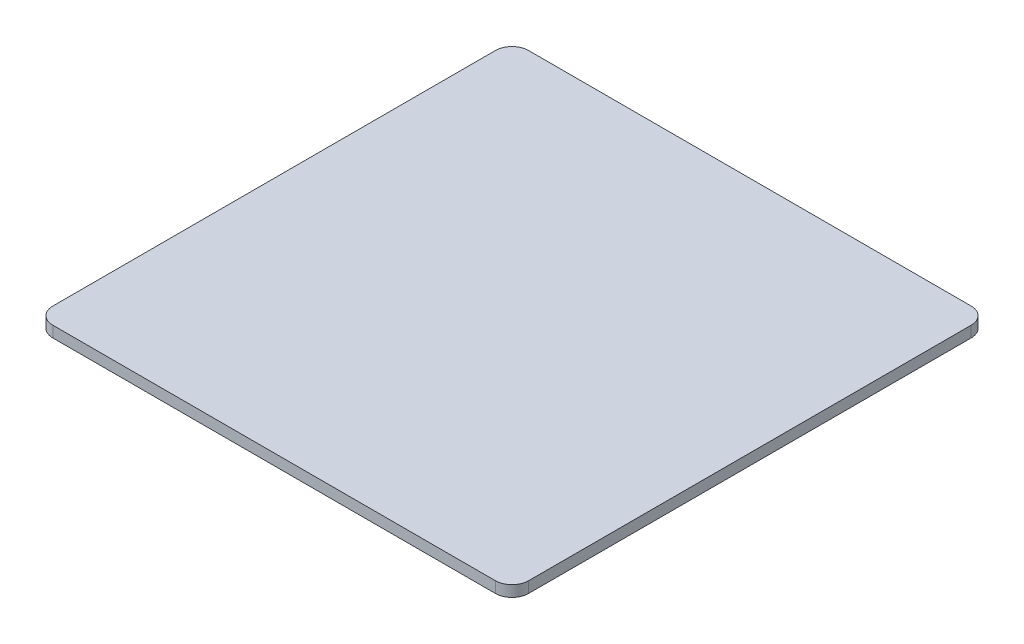
ISO-10303-21;
HEADER;
FILE_DESCRIPTION(('STEP AP214'),'2;1');
FILE_NAME('part.step','',(''),(''),'','','');
FILE_SCHEMA(('AUTOMOTIVE_DESIGN { 1 0 10303 214 1 1 1 1 }'));
ENDSEC;
DATA;
#1=APPLICATION_CONTEXT('core data for automotive mechanical design processes');
#2=APPLICATION_PROTOCOL_DEFINITION('international standard','automotive_design',2000,#1);
#3=PRODUCT_CONTEXT('',#1,'mechanical');
#4=PRODUCT('Part','Part','',(#3));
#5=PRODUCT_RELATED_PRODUCT_CATEGORY('part','',(#4));
#6=PRODUCT_DEFINITION_FORMATION('','',#4);
#7=PRODUCT_DEFINITION_CONTEXT('part definition',#1,'design');
#8=PRODUCT_DEFINITION('design','',#6,#7);
#9=PRODUCT_DEFINITION_SHAPE('','',#8);
#10=(LENGTH_UNIT() NAMED_UNIT(*) SI_UNIT(.MILLI.,.METRE.));
#11=(NAMED_UNIT(*) PLANE_ANGLE_UNIT() SI_UNIT($,.RADIAN.));
#12=(NAMED_UNIT(*) SI_UNIT($,.STERADIAN.) SOLID_ANGLE_UNIT());
#13=UNCERTAINTY_MEASURE_WITH_UNIT(LENGTH_MEASURE(1.E-05),#10,'distance_accuracy_value','');
#14=(GEOMETRIC_REPRESENTATION_CONTEXT(3) GLOBAL_UNCERTAINTY_ASSIGNED_CONTEXT((#13)) GLOBAL_UNIT_ASSIGNED_CONTEXT((#10,
#11,#12)) REPRESENTATION_CONTEXT('',''));
#15=CARTESIAN_POINT('',(0.,0.,0.));
#16=DIRECTION('',(0.,0.,1.));
#17=DIRECTION('',(1.,0.,0.));
#18=AXIS2_PLACEMENT_3D('',#15,#16,#17);
#19=CARTESIAN_POINT('',(43.,2.,43.));
#20=DIRECTION('',(-1.,0.,0.));
#21=DIRECTION('',(0.,0.,1.));
#22=AXIS2_PLACEMENT_3D('',#19,#20,#21);
#23=PLANE('',#22);
#24=DIRECTION('',(0.,0.,-1.));
#25=VECTOR('',#24,1.);
#26=CARTESIAN_POINT('',(43.,0.,43.));
#27=LINE('',#26,#25);
#28=CARTESIAN_POINT('',(43.,0.,40.));
#29=VERTEX_POINT('',#28);
#30=CARTESIAN_POINT('',(43.,0.,-40.));
#31=VERTEX_POINT('',#30);
#32=EDGE_CURVE('E130',#29,#31,#27,.T.);
#33=ORIENTED_EDGE('',*,*,#32,.T.);
#34=DIRECTION('',(0.,-1.,0.));
#35=VECTOR('',#34,1.);
#36=CARTESIAN_POINT('',(43.,2.,-40.));
#37=LINE('',#36,#35);
#38=CARTESIAN_POINT('',(43.,2.,-40.));
#39=VERTEX_POINT('',#38);
#40=EDGE_CURVE('E153',#31,#39,#37,.F.);
#41=ORIENTED_EDGE('',*,*,#40,.T.);
#42=DIRECTION('',(0.,0.,-1.));
#43=VECTOR('',#42,1.);
#44=CARTESIAN_POINT('',(43.,2.,43.));
#45=LINE('',#44,#43);
#46=CARTESIAN_POINT('',(43.,2.,40.));
#47=VERTEX_POINT('',#46);
#48=EDGE_CURVE('E128',#47,#39,#45,.T.);
#49=ORIENTED_EDGE('',*,*,#48,.F.);
#50=DIRECTION('',(0.,-1.,0.));
#51=VECTOR('',#50,1.);
#52=CARTESIAN_POINT('',(43.,2.,40.));
#53=LINE('',#52,#51);
#54=EDGE_CURVE('E150',#47,#29,#53,.T.);
#55=ORIENTED_EDGE('',*,*,#54,.T.);
#56=EDGE_LOOP('',(#33,#41,#49,#55));
#57=FACE_BOUND('',#56,.T.);
#58=ADVANCED_FACE('F35',(#57),#23,.F.);
#59=CARTESIAN_POINT('',(-43.,2.,-43.));
#60=DIRECTION('',(0.,0.,1.));
#61=DIRECTION('',(1.,0.,0.));
#62=AXIS2_PLACEMENT_3D('',#59,#60,#61);
#63=PLANE('',#62);
#64=DIRECTION('',(-1.,0.,0.));
#65=VECTOR('',#64,1.);
#66=CARTESIAN_POINT('',(-43.,0.,-43.));
#67=LINE('',#66,#65);
#68=CARTESIAN_POINT('',(40.,0.,-43.));
#69=VERTEX_POINT('',#68);
#70=CARTESIAN_POINT('',(-40.,0.,-43.));
#71=VERTEX_POINT('',#70);
#72=EDGE_CURVE('E126',#69,#71,#67,.T.);
#73=ORIENTED_EDGE('',*,*,#72,.T.);
#74=DIRECTION('',(0.,-1.,0.));
#75=VECTOR('',#74,1.);
#76=CARTESIAN_POINT('',(-40.,2.,-43.));
#77=LINE('',#76,#75);
#78=CARTESIAN_POINT('',(-40.,2.,-43.));
#79=VERTEX_POINT('',#78);
#80=EDGE_CURVE('E105',#71,#79,#77,.F.);
#81=ORIENTED_EDGE('',*,*,#80,.T.);
#82=DIRECTION('',(-1.,0.,0.));
#83=VECTOR('',#82,1.);
#84=CARTESIAN_POINT('',(-43.,2.,-43.));
#85=LINE('',#84,#83);
#86=CARTESIAN_POINT('',(40.,2.,-43.));
#87=VERTEX_POINT('',#86);
#88=EDGE_CURVE('E169',#87,#79,#85,.T.);
#89=ORIENTED_EDGE('',*,*,#88,.F.);
#90=DIRECTION('',(0.,-1.,0.));
#91=VECTOR('',#90,1.);
#92=CARTESIAN_POINT('',(40.,2.,-43.));
#93=LINE('',#92,#91);
#94=EDGE_CURVE('E110',#87,#69,#93,.T.);
#95=ORIENTED_EDGE('',*,*,#94,.T.);
#96=EDGE_LOOP('',(#73,#81,#89,#95));
#97=FACE_BOUND('',#96,.T.);
#98=ADVANCED_FACE('F186',(#97),#63,.F.);
#99=CARTESIAN_POINT('',(-43.,2.,43.));
#100=DIRECTION('',(1.,0.,0.));
#101=DIRECTION('',(0.,0.,-1.));
#102=AXIS2_PLACEMENT_3D('',#99,#100,#101);
#103=PLANE('',#102);
#104=DIRECTION('',(0.,0.,1.));
#105=VECTOR('',#104,1.);
#106=CARTESIAN_POINT('',(-43.,2.,43.));
#107=LINE('',#106,#105);
#108=CARTESIAN_POINT('',(-43.,2.,-40.));
#109=VERTEX_POINT('',#108);
#110=CARTESIAN_POINT('',(-43.,2.,40.));
#111=VERTEX_POINT('',#110);
#112=EDGE_CURVE('E119',#109,#111,#107,.T.);
#113=ORIENTED_EDGE('',*,*,#112,.F.);
#114=DIRECTION('',(0.,-1.,0.));
#115=VECTOR('',#114,1.);
#116=CARTESIAN_POINT('',(-43.,2.,-40.));
#117=LINE('',#116,#115);
#118=CARTESIAN_POINT('',(-43.,0.,-40.));
#119=VERTEX_POINT('',#118);
#120=EDGE_CURVE('E104',#109,#119,#117,.T.);
#121=ORIENTED_EDGE('',*,*,#120,.T.);
#122=DIRECTION('',(0.,0.,1.));
#123=VECTOR('',#122,1.);
#124=CARTESIAN_POINT('',(-43.,0.,43.));
#125=LINE('',#124,#123);
#126=CARTESIAN_POINT('',(-43.,0.,40.));
#127=VERTEX_POINT('',#126);
#128=EDGE_CURVE('E117',#119,#127,#125,.T.);
#129=ORIENTED_EDGE('',*,*,#128,.T.);
#130=DIRECTION('',(0.,-1.,0.));
#131=VECTOR('',#130,1.);
#132=CARTESIAN_POINT('',(-43.,2.,40.));
#133=LINE('',#132,#131);
#134=EDGE_CURVE('E121',#127,#111,#133,.F.);
#135=ORIENTED_EDGE('',*,*,#134,.T.);
#136=EDGE_LOOP('',(#113,#121,#129,#135));
#137=FACE_BOUND('',#136,.T.);
#138=ADVANCED_FACE('F116',(#137),#103,.F.);
#139=CARTESIAN_POINT('',(-43.,2.,43.));
#140=DIRECTION('',(0.,0.,-1.));
#141=DIRECTION('',(-1.,0.,0.));
#142=AXIS2_PLACEMENT_3D('',#139,#140,#141);
#143=PLANE('',#142);
#144=DIRECTION('',(1.,0.,0.));
#145=VECTOR('',#144,1.);
#146=CARTESIAN_POINT('',(-43.,0.,43.));
#147=LINE('',#146,#145);
#148=CARTESIAN_POINT('',(-40.,0.,43.));
#149=VERTEX_POINT('',#148);
#150=CARTESIAN_POINT('',(40.,0.,43.));
#151=VERTEX_POINT('',#150);
#152=EDGE_CURVE('E125',#149,#151,#147,.T.);
#153=ORIENTED_EDGE('',*,*,#152,.T.);
#154=DIRECTION('',(0.,-1.,0.));
#155=VECTOR('',#154,1.);
#156=CARTESIAN_POINT('',(40.,2.,43.));
#157=LINE('',#156,#155);
#158=CARTESIAN_POINT('',(40.,2.,43.));
#159=VERTEX_POINT('',#158);
#160=EDGE_CURVE('E11',#151,#159,#157,.F.);
#161=ORIENTED_EDGE('',*,*,#160,.T.);
#162=DIRECTION('',(1.,0.,0.));
#163=VECTOR('',#162,1.);
#164=CARTESIAN_POINT('',(-43.,2.,43.));
#165=LINE('',#164,#163);
#166=CARTESIAN_POINT('',(-40.,2.,43.));
#167=VERTEX_POINT('',#166);
#168=EDGE_CURVE('E134',#167,#159,#165,.T.);
#169=ORIENTED_EDGE('',*,*,#168,.F.);
#170=DIRECTION('',(0.,-1.,0.));
#171=VECTOR('',#170,1.);
#172=CARTESIAN_POINT('',(-40.,2.,43.));
#173=LINE('',#172,#171);
#174=EDGE_CURVE('E43',#167,#149,#173,.T.);
#175=ORIENTED_EDGE('',*,*,#174,.T.);
#176=EDGE_LOOP('',(#153,#161,#169,#175));
#177=FACE_BOUND('',#176,.T.);
#178=ADVANCED_FACE('F156',(#177),#143,.F.);
#179=CARTESIAN_POINT('',(0.,2.,0.));
#180=DIRECTION('',(0.,-1.,0.));
#181=DIRECTION('',(0.,0.,-1.));
#182=AXIS2_PLACEMENT_3D('',#179,#180,#181);
#183=PLANE('',#182);
#184=ORIENTED_EDGE('',*,*,#88,.T.);
#185=CARTESIAN_POINT('',(-40.,2.,-40.));
#186=DIRECTION('',(0.,-1.,0.));
#187=DIRECTION('',(0.,0.,-1.));
#188=AXIS2_PLACEMENT_3D('',#185,#186,#187);
#189=CIRCLE('',#188,3.);
#190=EDGE_CURVE('E148',#79,#109,#189,.F.);
#191=ORIENTED_EDGE('',*,*,#190,.T.);
#192=ORIENTED_EDGE('',*,*,#112,.T.);
#193=CARTESIAN_POINT('',(-40.,2.,40.));
#194=DIRECTION('',(0.,-1.,0.));
#195=DIRECTION('',(0.,0.,-1.));
#196=AXIS2_PLACEMENT_3D('',#193,#194,#195);
#197=CIRCLE('',#196,3.);
#198=EDGE_CURVE('E55',#111,#167,#197,.F.);
#199=ORIENTED_EDGE('',*,*,#198,.T.);
#200=ORIENTED_EDGE('',*,*,#168,.T.);
#201=CARTESIAN_POINT('',(40.,2.,40.));
#202=DIRECTION('',(0.,-1.,0.));
#203=DIRECTION('',(0.,0.,-1.));
#204=AXIS2_PLACEMENT_3D('',#201,#202,#203);
#205=CIRCLE('',#204,3.);
#206=EDGE_CURVE('E144',#159,#47,#205,.F.);
#207=ORIENTED_EDGE('',*,*,#206,.T.);
#208=ORIENTED_EDGE('',*,*,#48,.T.);
#209=CARTESIAN_POINT('',(40.,2.,-40.));
#210=DIRECTION('',(0.,-1.,0.));
#211=DIRECTION('',(0.,0.,-1.));
#212=AXIS2_PLACEMENT_3D('',#209,#210,#211);
#213=CIRCLE('',#212,3.);
#214=EDGE_CURVE('E146',#39,#87,#213,.F.);
#215=ORIENTED_EDGE('',*,*,#214,.T.);
#216=EDGE_LOOP('',(#184,#191,#192,#199,#200,#207,#208,#215));
#217=FACE_BOUND('',#216,.T.);
#218=ADVANCED_FACE('F175',(#217),#183,.F.);
#219=CARTESIAN_POINT('',(0.,0.,0.));
#220=DIRECTION('',(0.,-1.,0.));
#221=DIRECTION('',(0.,0.,-1.));
#222=AXIS2_PLACEMENT_3D('',#219,#220,#221);
#223=PLANE('',#222);
#224=ORIENTED_EDGE('',*,*,#128,.F.);
#225=CARTESIAN_POINT('',(-40.,0.,-40.));
#226=DIRECTION('',(0.,-1.,0.));
#227=DIRECTION('',(0.,0.,-1.));
#228=AXIS2_PLACEMENT_3D('',#225,#226,#227);
#229=CIRCLE('',#228,3.);
#230=EDGE_CURVE('E100',#119,#71,#229,.T.);
#231=ORIENTED_EDGE('',*,*,#230,.T.);
#232=ORIENTED_EDGE('',*,*,#72,.F.);
#233=CARTESIAN_POINT('',(40.,0.,-40.));
#234=DIRECTION('',(0.,-1.,0.));
#235=DIRECTION('',(0.,0.,-1.));
#236=AXIS2_PLACEMENT_3D('',#233,#234,#235);
#237=CIRCLE('',#236,3.);
#238=EDGE_CURVE('E111',#69,#31,#237,.T.);
#239=ORIENTED_EDGE('',*,*,#238,.T.);
#240=ORIENTED_EDGE('',*,*,#32,.F.);
#241=CARTESIAN_POINT('',(40.,0.,40.));
#242=DIRECTION('',(0.,-1.,0.));
#243=DIRECTION('',(0.,0.,-1.));
#244=AXIS2_PLACEMENT_3D('',#241,#242,#243);
#245=CIRCLE('',#244,3.);
#246=EDGE_CURVE('E137',#29,#151,#245,.T.);
#247=ORIENTED_EDGE('',*,*,#246,.T.);
#248=ORIENTED_EDGE('',*,*,#152,.F.);
#249=CARTESIAN_POINT('',(-40.,0.,40.));
#250=DIRECTION('',(0.,-1.,0.));
#251=DIRECTION('',(0.,0.,-1.));
#252=AXIS2_PLACEMENT_3D('',#249,#250,#251);
#253=CIRCLE('',#252,3.);
#254=EDGE_CURVE('E120',#149,#127,#253,.T.);
#255=ORIENTED_EDGE('',*,*,#254,.T.);
#256=EDGE_LOOP('',(#224,#231,#232,#239,#240,#247,#248,#255));
#257=FACE_BOUND('',#256,.T.);
#258=ADVANCED_FACE('F123',(#257),#223,.T.);
#259=CARTESIAN_POINT('',(-40.,2.,-40.));
#260=DIRECTION('',(0.,-1.,0.));
#261=DIRECTION('',(0.,0.,-1.));
#262=AXIS2_PLACEMENT_3D('',#259,#260,#261);
#263=CYLINDRICAL_SURFACE('',#262,3.);
#264=ORIENTED_EDGE('',*,*,#190,.F.);
#265=ORIENTED_EDGE('',*,*,#80,.F.);
#266=ORIENTED_EDGE('',*,*,#230,.F.);
#267=ORIENTED_EDGE('',*,*,#120,.F.);
#268=EDGE_LOOP('',(#264,#265,#266,#267));
#269=FACE_BOUND('',#268,.T.);
#270=ADVANCED_FACE('F103',(#269),#263,.T.);
#271=CARTESIAN_POINT('',(40.,2.,-40.));
#272=DIRECTION('',(0.,-1.,0.));
#273=DIRECTION('',(0.,0.,-1.));
#274=AXIS2_PLACEMENT_3D('',#271,#272,#273);
#275=CYLINDRICAL_SURFACE('',#274,3.);
#276=ORIENTED_EDGE('',*,*,#214,.F.);
#277=ORIENTED_EDGE('',*,*,#40,.F.);
#278=ORIENTED_EDGE('',*,*,#238,.F.);
#279=ORIENTED_EDGE('',*,*,#94,.F.);
#280=EDGE_LOOP('',(#276,#277,#278,#279));
#281=FACE_BOUND('',#280,.T.);
#282=ADVANCED_FACE('F197',(#281),#275,.T.);
#283=CARTESIAN_POINT('',(40.,2.,40.));
#284=DIRECTION('',(0.,-1.,0.));
#285=DIRECTION('',(0.,0.,-1.));
#286=AXIS2_PLACEMENT_3D('',#283,#284,#285);
#287=CYLINDRICAL_SURFACE('',#286,3.);
#288=ORIENTED_EDGE('',*,*,#206,.F.);
#289=ORIENTED_EDGE('',*,*,#160,.F.);
#290=ORIENTED_EDGE('',*,*,#246,.F.);
#291=ORIENTED_EDGE('',*,*,#54,.F.);
#292=EDGE_LOOP('',(#288,#289,#290,#291));
#293=FACE_BOUND('',#292,.T.);
#294=ADVANCED_FACE('F163',(#293),#287,.T.);
#295=CARTESIAN_POINT('',(-40.,2.,40.));
#296=DIRECTION('',(0.,-1.,0.));
#297=DIRECTION('',(0.,0.,-1.));
#298=AXIS2_PLACEMENT_3D('',#295,#296,#297);
#299=CYLINDRICAL_SURFACE('',#298,3.);
#300=ORIENTED_EDGE('',*,*,#198,.F.);
#301=ORIENTED_EDGE('',*,*,#134,.F.);
#302=ORIENTED_EDGE('',*,*,#254,.F.);
#303=ORIENTED_EDGE('',*,*,#174,.F.);
#304=EDGE_LOOP('',(#300,#301,#302,#303));
#305=FACE_BOUND('',#304,.T.);
#306=ADVANCED_FACE('F37',(#305),#299,.T.);
#307=CLOSED_SHELL('',(#58,#98,#138,#178,#218,#258,#270,#282,#294,#306));
#308=MANIFOLD_SOLID_BREP('B2',#307);
#309=ADVANCED_BREP_SHAPE_REPRESENTATION('',(#18,#308),#14);
#310=SHAPE_DEFINITION_REPRESENTATION(#9,#309);
ENDSEC;
END-ISO-10303-21;
